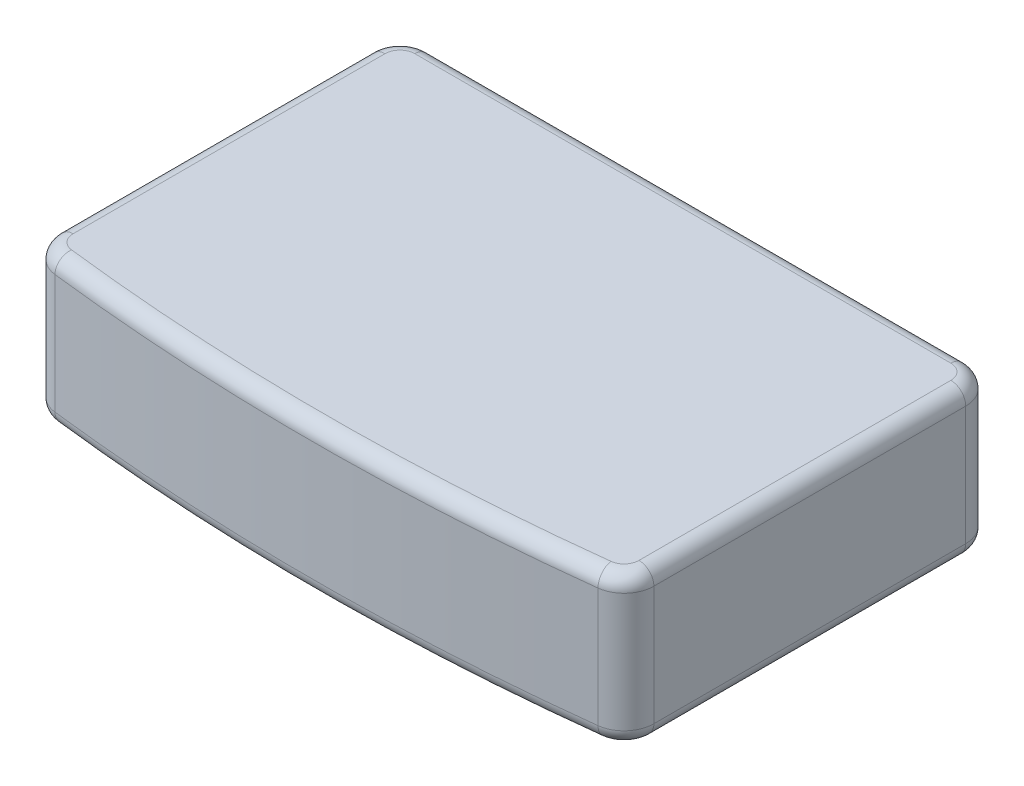
ISO-10303-21;
HEADER;
FILE_DESCRIPTION(('STEP AP214'),'2;1');
FILE_NAME('part.step','',(''),(''),'','','');
FILE_SCHEMA(('AUTOMOTIVE_DESIGN { 1 0 10303 214 1 1 1 1 }'));
ENDSEC;
DATA;
#1=APPLICATION_CONTEXT('core data for automotive mechanical design processes');
#2=APPLICATION_PROTOCOL_DEFINITION('international standard','automotive_design',2000,#1);
#3=PRODUCT_CONTEXT('',#1,'mechanical');
#4=PRODUCT('Part','Part','',(#3));
#5=PRODUCT_RELATED_PRODUCT_CATEGORY('part','',(#4));
#6=PRODUCT_DEFINITION_FORMATION('','',#4);
#7=PRODUCT_DEFINITION_CONTEXT('part definition',#1,'design');
#8=PRODUCT_DEFINITION('design','',#6,#7);
#9=PRODUCT_DEFINITION_SHAPE('','',#8);
#10=(LENGTH_UNIT() NAMED_UNIT(*) SI_UNIT(.MILLI.,.METRE.));
#11=(NAMED_UNIT(*) PLANE_ANGLE_UNIT() SI_UNIT($,.RADIAN.));
#12=(NAMED_UNIT(*) SI_UNIT($,.STERADIAN.) SOLID_ANGLE_UNIT());
#13=UNCERTAINTY_MEASURE_WITH_UNIT(LENGTH_MEASURE(1.E-05),#10,'distance_accuracy_value','');
#14=(GEOMETRIC_REPRESENTATION_CONTEXT(3) GLOBAL_UNCERTAINTY_ASSIGNED_CONTEXT((#13)) GLOBAL_UNIT_ASSIGNED_CONTEXT((#10,
#11,#12)) REPRESENTATION_CONTEXT('',''));
#15=CARTESIAN_POINT('',(0.,0.,0.));
#16=DIRECTION('',(0.,0.,1.));
#17=DIRECTION('',(1.,0.,0.));
#18=AXIS2_PLACEMENT_3D('',#15,#16,#17);
#19=CARTESIAN_POINT('',(0.499999999999997,5.,-0.643681576745131));
#20=DIRECTION('',(-1.,0.,0.));
#21=DIRECTION('',(0.,0.,1.));
#22=AXIS2_PLACEMENT_3D('',#19,#20,#21);
#23=PLANE('',#22);
#24=DIRECTION('',(0.,-1.,0.));
#25=VECTOR('',#24,1.);
#26=CARTESIAN_POINT('',(0.499999999999997,5.,-12.));
#27=LINE('',#26,#25);
#28=CARTESIAN_POINT('',(0.499999999999997,4.5,-12.));
#29=VERTEX_POINT('',#28);
#30=CARTESIAN_POINT('',(0.499999999999997,0.5,-12.));
#31=VERTEX_POINT('',#30);
#32=EDGE_CURVE('E290',#29,#31,#27,.T.);
#33=ORIENTED_EDGE('',*,*,#32,.T.);
#34=DIRECTION('',(0.,0.,-1.));
#35=VECTOR('',#34,1.);
#36=CARTESIAN_POINT('',(0.499999999999997,0.5,-1.52778282277936));
#37=LINE('',#36,#35);
#38=CARTESIAN_POINT('',(0.499999999999997,0.5,-1.52778282277936));
#39=VERTEX_POINT('',#38);
#40=EDGE_CURVE('E189',#31,#39,#37,.F.);
#41=ORIENTED_EDGE('',*,*,#40,.T.);
#42=DIRECTION('',(0.,1.,0.));
#43=VECTOR('',#42,1.);
#44=CARTESIAN_POINT('',(0.499999999999997,5.,-1.52778282277936));
#45=LINE('',#44,#43);
#46=CARTESIAN_POINT('',(0.499999999999997,4.5,-1.52778282277936));
#47=VERTEX_POINT('',#46);
#48=EDGE_CURVE('E321',#39,#47,#45,.T.);
#49=ORIENTED_EDGE('',*,*,#48,.T.);
#50=DIRECTION('',(0.,0.,-1.));
#51=VECTOR('',#50,1.);
#52=CARTESIAN_POINT('',(0.499999999999997,4.5,-0.643681576745131));
#53=LINE('',#52,#51);
#54=EDGE_CURVE('E187',#47,#29,#53,.T.);
#55=ORIENTED_EDGE('',*,*,#54,.T.);
#56=EDGE_LOOP('',(#33,#41,#49,#55));
#57=FACE_BOUND('',#56,.T.);
#58=ADVANCED_FACE('F35',(#57),#23,.T.);
#59=CARTESIAN_POINT('',(10.5,5.,-78.));
#60=DIRECTION('',(0.,-1.,0.));
#61=DIRECTION('',(0.,0.,-1.));
#62=AXIS2_PLACEMENT_3D('',#59,#60,#61);
#63=CYLINDRICAL_SURFACE('',#62,78.);
#64=DIRECTION('',(0.,-1.,0.));
#65=VECTOR('',#64,1.);
#66=CARTESIAN_POINT('',(1.38311688311688,5.,-0.534637145153116));
#67=LINE('',#66,#65);
#68=CARTESIAN_POINT('',(1.38311688311688,4.5,-0.534637145153116));
#69=VERTEX_POINT('',#68);
#70=CARTESIAN_POINT('',(1.38311688311688,0.5,-0.534637145153116));
#71=VERTEX_POINT('',#70);
#72=EDGE_CURVE('E288',#69,#71,#67,.T.);
#73=ORIENTED_EDGE('',*,*,#72,.T.);
#74=CARTESIAN_POINT('',(10.5,0.5,-78.));
#75=DIRECTION('',(0.,1.,0.));
#76=DIRECTION('',(0.,0.,1.));
#77=AXIS2_PLACEMENT_3D('',#74,#75,#76);
#78=CIRCLE('',#77,78.);
#79=CARTESIAN_POINT('',(19.6168831168831,0.5,-0.534637145153116));
#80=VERTEX_POINT('',#79);
#81=EDGE_CURVE('E197',#71,#80,#78,.T.);
#82=ORIENTED_EDGE('',*,*,#81,.T.);
#83=DIRECTION('',(0.,-1.,0.));
#84=VECTOR('',#83,1.);
#85=CARTESIAN_POINT('',(19.6168831168831,5.,-0.534637145153116));
#86=LINE('',#85,#84);
#87=CARTESIAN_POINT('',(19.6168831168831,4.5,-0.534637145153116));
#88=VERTEX_POINT('',#87);
#89=EDGE_CURVE('E171',#80,#88,#86,.F.);
#90=ORIENTED_EDGE('',*,*,#89,.T.);
#91=CARTESIAN_POINT('',(10.5,4.5,-78.));
#92=DIRECTION('',(0.,1.,0.));
#93=DIRECTION('',(0.,0.,1.));
#94=AXIS2_PLACEMENT_3D('',#91,#92,#93);
#95=CIRCLE('',#94,78.);
#96=EDGE_CURVE('E195',#88,#69,#95,.F.);
#97=ORIENTED_EDGE('',*,*,#96,.T.);
#98=EDGE_LOOP('',(#73,#82,#90,#97));
#99=FACE_BOUND('',#98,.T.);
#100=ADVANCED_FACE('F285',(#99),#63,.T.);
#101=CARTESIAN_POINT('',(20.5,5.,-0.643681576745131));
#102=DIRECTION('',(-1.,0.,0.));
#103=DIRECTION('',(0.,0.,1.));
#104=AXIS2_PLACEMENT_3D('',#101,#102,#103);
#105=PLANE('',#104);
#106=DIRECTION('',(0.,-1.,0.));
#107=VECTOR('',#106,1.);
#108=CARTESIAN_POINT('',(20.5,5.,-1.52778282277936));
#109=LINE('',#108,#107);
#110=CARTESIAN_POINT('',(20.5,4.5,-1.52778282277936));
#111=VERTEX_POINT('',#110);
#112=CARTESIAN_POINT('',(20.5,0.5,-1.52778282277936));
#113=VERTEX_POINT('',#112);
#114=EDGE_CURVE('E282',#111,#113,#109,.T.);
#115=ORIENTED_EDGE('',*,*,#114,.T.);
#116=DIRECTION('',(0.,0.,-1.));
#117=VECTOR('',#116,1.);
#118=CARTESIAN_POINT('',(20.5,0.5,-0.643681576745131));
#119=LINE('',#118,#117);
#120=CARTESIAN_POINT('',(20.5,0.5,-12.));
#121=VERTEX_POINT('',#120);
#122=EDGE_CURVE('E205',#113,#121,#119,.T.);
#123=ORIENTED_EDGE('',*,*,#122,.T.);
#124=DIRECTION('',(0.,-1.,0.));
#125=VECTOR('',#124,1.);
#126=CARTESIAN_POINT('',(20.5,5.,-12.));
#127=LINE('',#126,#125);
#128=CARTESIAN_POINT('',(20.5,4.5,-12.));
#129=VERTEX_POINT('',#128);
#130=EDGE_CURVE('E322',#121,#129,#127,.F.);
#131=ORIENTED_EDGE('',*,*,#130,.T.);
#132=DIRECTION('',(0.,0.,-1.));
#133=VECTOR('',#132,1.);
#134=CARTESIAN_POINT('',(20.5,4.5,-1.52778282277936));
#135=LINE('',#134,#133);
#136=EDGE_CURVE('E203',#129,#111,#135,.F.);
#137=ORIENTED_EDGE('',*,*,#136,.T.);
#138=EDGE_LOOP('',(#115,#123,#131,#137));
#139=FACE_BOUND('',#138,.T.);
#140=ADVANCED_FACE('F364',(#139),#105,.F.);
#141=CARTESIAN_POINT('',(0.499999999999997,5.,-13.));
#142=DIRECTION('',(0.,0.,-1.));
#143=DIRECTION('',(-1.,0.,0.));
#144=AXIS2_PLACEMENT_3D('',#141,#142,#143);
#145=PLANE('',#144);
#146=DIRECTION('',(0.,-1.,0.));
#147=VECTOR('',#146,1.);
#148=CARTESIAN_POINT('',(19.5,0.,-13.));
#149=LINE('',#148,#147);
#150=CARTESIAN_POINT('',(19.5,4.5,-13.));
#151=VERTEX_POINT('',#150);
#152=CARTESIAN_POINT('',(19.5,0.5,-13.));
#153=VERTEX_POINT('',#152);
#154=EDGE_CURVE('E328',#151,#153,#149,.T.);
#155=ORIENTED_EDGE('',*,*,#154,.T.);
#156=DIRECTION('',(1.,0.,0.));
#157=VECTOR('',#156,1.);
#158=CARTESIAN_POINT('',(1.5,0.5,-13.));
#159=LINE('',#158,#157);
#160=CARTESIAN_POINT('',(1.5,0.5,-13.));
#161=VERTEX_POINT('',#160);
#162=EDGE_CURVE('E11',#153,#161,#159,.F.);
#163=ORIENTED_EDGE('',*,*,#162,.T.);
#164=DIRECTION('',(0.,-1.,0.));
#165=VECTOR('',#164,1.);
#166=CARTESIAN_POINT('',(1.5,5.,-13.));
#167=LINE('',#166,#165);
#168=CARTESIAN_POINT('',(1.5,4.5,-13.));
#169=VERTEX_POINT('',#168);
#170=EDGE_CURVE('E319',#161,#169,#167,.F.);
#171=ORIENTED_EDGE('',*,*,#170,.T.);
#172=DIRECTION('',(1.,0.,0.));
#173=VECTOR('',#172,1.);
#174=CARTESIAN_POINT('',(0.499999999999997,4.5,-13.));
#175=LINE('',#174,#173);
#176=EDGE_CURVE('E44',#169,#151,#175,.T.);
#177=ORIENTED_EDGE('',*,*,#176,.T.);
#178=EDGE_LOOP('',(#155,#163,#171,#177));
#179=FACE_BOUND('',#178,.T.);
#180=ADVANCED_FACE('F367',(#179),#145,.T.);
#181=CARTESIAN_POINT('',(10.5,5.,-78.));
#182=DIRECTION('',(0.,1.,0.));
#183=DIRECTION('',(0.,0.,1.));
#184=AXIS2_PLACEMENT_3D('',#181,#182,#183);
#185=PLANE('',#184);
#186=DIRECTION('',(1.,0.,0.));
#187=VECTOR('',#186,1.);
#188=CARTESIAN_POINT('',(10.5,5.,-12.5));
#189=LINE('',#188,#187);
#190=CARTESIAN_POINT('',(19.5,5.,-12.5));
#191=VERTEX_POINT('',#190);
#192=CARTESIAN_POINT('',(1.5,5.,-12.5));
#193=VERTEX_POINT('',#192);
#194=EDGE_CURVE('E211',#191,#193,#189,.F.);
#195=ORIENTED_EDGE('',*,*,#194,.T.);
#196=CARTESIAN_POINT('',(1.5,5.,-12.));
#197=DIRECTION('',(0.,1.,0.));
#198=DIRECTION('',(0.,0.,1.));
#199=AXIS2_PLACEMENT_3D('',#196,#197,#198);
#200=CIRCLE('',#199,0.5);
#201=CARTESIAN_POINT('',(0.999999999999997,5.,-12.));
#202=VERTEX_POINT('',#201);
#203=EDGE_CURVE('E224',#193,#202,#200,.T.);
#204=ORIENTED_EDGE('',*,*,#203,.T.);
#205=DIRECTION('',(0.,0.,-1.));
#206=VECTOR('',#205,1.);
#207=CARTESIAN_POINT('',(0.999999999999997,5.,-78.));
#208=LINE('',#207,#206);
#209=CARTESIAN_POINT('',(0.999999999999996,5.,-1.52778282277936));
#210=VERTEX_POINT('',#209);
#211=EDGE_CURVE('E59',#202,#210,#208,.F.);
#212=ORIENTED_EDGE('',*,*,#211,.T.);
#213=CARTESIAN_POINT('',(1.5,5.,-1.52778282277936));
#214=DIRECTION('',(0.,1.,0.));
#215=DIRECTION('',(0.,0.,1.));
#216=AXIS2_PLACEMENT_3D('',#213,#214,#215);
#217=CIRCLE('',#216,0.5);
#218=CARTESIAN_POINT('',(1.44155844155844,5.,-1.03120998396623));
#219=VERTEX_POINT('',#218);
#220=EDGE_CURVE('E221',#210,#219,#217,.T.);
#221=ORIENTED_EDGE('',*,*,#220,.T.);
#222=CARTESIAN_POINT('',(10.5,5.,-78.));
#223=DIRECTION('',(0.,1.,0.));
#224=DIRECTION('',(0.,0.,1.));
#225=AXIS2_PLACEMENT_3D('',#222,#223,#224);
#226=CIRCLE('',#225,77.5);
#227=CARTESIAN_POINT('',(19.5584415584416,5.,-1.03120998396624));
#228=VERTEX_POINT('',#227);
#229=EDGE_CURVE('E219',#219,#228,#226,.T.);
#230=ORIENTED_EDGE('',*,*,#229,.T.);
#231=CARTESIAN_POINT('',(19.5,5.,-1.52778282277936));
#232=DIRECTION('',(0.,1.,0.));
#233=DIRECTION('',(0.,0.,1.));
#234=AXIS2_PLACEMENT_3D('',#231,#232,#233);
#235=CIRCLE('',#234,0.5);
#236=CARTESIAN_POINT('',(20.,5.,-1.52778282277936));
#237=VERTEX_POINT('',#236);
#238=EDGE_CURVE('E217',#228,#237,#235,.T.);
#239=ORIENTED_EDGE('',*,*,#238,.T.);
#240=DIRECTION('',(0.,0.,-1.));
#241=VECTOR('',#240,1.);
#242=CARTESIAN_POINT('',(20.,5.,-12.));
#243=LINE('',#242,#241);
#244=CARTESIAN_POINT('',(20.,5.,-12.));
#245=VERTEX_POINT('',#244);
#246=EDGE_CURVE('E215',#237,#245,#243,.T.);
#247=ORIENTED_EDGE('',*,*,#246,.T.);
#248=CARTESIAN_POINT('',(19.5,5.,-12.));
#249=DIRECTION('',(0.,1.,0.));
#250=DIRECTION('',(0.,0.,1.));
#251=AXIS2_PLACEMENT_3D('',#248,#249,#250);
#252=CIRCLE('',#251,0.5);
#253=EDGE_CURVE('E213',#245,#191,#252,.T.);
#254=ORIENTED_EDGE('',*,*,#253,.T.);
#255=EDGE_LOOP('',(#195,#204,#212,#221,#230,#239,#247,#254));
#256=FACE_BOUND('',#255,.T.);
#257=ADVANCED_FACE('F488',(#256),#185,.T.);
#258=CARTESIAN_POINT('',(10.5,0.,-78.));
#259=DIRECTION('',(0.,1.,0.));
#260=DIRECTION('',(0.,0.,1.));
#261=AXIS2_PLACEMENT_3D('',#258,#259,#260);
#262=PLANE('',#261);
#263=DIRECTION('',(0.,0.,-1.));
#264=VECTOR('',#263,1.);
#265=CARTESIAN_POINT('',(0.999999999999997,0.,-12.));
#266=LINE('',#265,#264);
#267=CARTESIAN_POINT('',(0.999999999999996,0.,-1.52778282277936));
#268=VERTEX_POINT('',#267);
#269=CARTESIAN_POINT('',(0.999999999999997,0.,-12.));
#270=VERTEX_POINT('',#269);
#271=EDGE_CURVE('E176',#268,#270,#266,.T.);
#272=ORIENTED_EDGE('',*,*,#271,.T.);
#273=CARTESIAN_POINT('',(1.5,0.,-12.));
#274=DIRECTION('',(0.,1.,0.));
#275=DIRECTION('',(0.,0.,1.));
#276=AXIS2_PLACEMENT_3D('',#273,#274,#275);
#277=CIRCLE('',#276,0.5);
#278=CARTESIAN_POINT('',(1.5,0.,-12.5));
#279=VERTEX_POINT('',#278);
#280=EDGE_CURVE('E156',#270,#279,#277,.F.);
#281=ORIENTED_EDGE('',*,*,#280,.T.);
#282=DIRECTION('',(1.,0.,0.));
#283=VECTOR('',#282,1.);
#284=CARTESIAN_POINT('',(19.5,0.,-12.5));
#285=LINE('',#284,#283);
#286=CARTESIAN_POINT('',(19.5,0.,-12.5));
#287=VERTEX_POINT('',#286);
#288=EDGE_CURVE('E164',#279,#287,#285,.T.);
#289=ORIENTED_EDGE('',*,*,#288,.T.);
#290=CARTESIAN_POINT('',(19.5,0.,-12.));
#291=DIRECTION('',(0.,1.,0.));
#292=DIRECTION('',(0.,0.,1.));
#293=AXIS2_PLACEMENT_3D('',#290,#291,#292);
#294=CIRCLE('',#293,0.5);
#295=CARTESIAN_POINT('',(20.,0.,-12.));
#296=VERTEX_POINT('',#295);
#297=EDGE_CURVE('E170',#287,#296,#294,.F.);
#298=ORIENTED_EDGE('',*,*,#297,.T.);
#299=DIRECTION('',(0.,0.,-1.));
#300=VECTOR('',#299,1.);
#301=CARTESIAN_POINT('',(20.,0.,-78.));
#302=LINE('',#301,#300);
#303=CARTESIAN_POINT('',(20.,0.,-1.52778282277936));
#304=VERTEX_POINT('',#303);
#305=EDGE_CURVE('E295',#296,#304,#302,.F.);
#306=ORIENTED_EDGE('',*,*,#305,.T.);
#307=CARTESIAN_POINT('',(19.5,0.,-1.52778282277936));
#308=DIRECTION('',(0.,1.,0.));
#309=DIRECTION('',(0.,0.,1.));
#310=AXIS2_PLACEMENT_3D('',#307,#308,#309);
#311=CIRCLE('',#310,0.5);
#312=CARTESIAN_POINT('',(19.5584415584416,0.,-1.03120998396624));
#313=VERTEX_POINT('',#312);
#314=EDGE_CURVE('E297',#304,#313,#311,.F.);
#315=ORIENTED_EDGE('',*,*,#314,.T.);
#316=CARTESIAN_POINT('',(10.5,0.,-78.));
#317=DIRECTION('',(0.,1.,0.));
#318=DIRECTION('',(0.,0.,1.));
#319=AXIS2_PLACEMENT_3D('',#316,#317,#318);
#320=CIRCLE('',#319,77.5);
#321=CARTESIAN_POINT('',(1.44155844155844,0.,-1.03120998396623));
#322=VERTEX_POINT('',#321);
#323=EDGE_CURVE('E299',#313,#322,#320,.F.);
#324=ORIENTED_EDGE('',*,*,#323,.T.);
#325=CARTESIAN_POINT('',(1.5,0.,-1.52778282277936));
#326=DIRECTION('',(0.,1.,0.));
#327=DIRECTION('',(0.,0.,1.));
#328=AXIS2_PLACEMENT_3D('',#325,#326,#327);
#329=CIRCLE('',#328,0.5);
#330=EDGE_CURVE('E182',#322,#268,#329,.F.);
#331=ORIENTED_EDGE('',*,*,#330,.T.);
#332=EDGE_LOOP('',(#272,#281,#289,#298,#306,#315,#324,#331));
#333=FACE_BOUND('',#332,.T.);
#334=CARTESIAN_POINT('',(5.5,0.,-9.));
#335=DIRECTION('',(0.,1.,0.));
#336=DIRECTION('',(0.,0.,1.));
#337=AXIS2_PLACEMENT_3D('',#334,#335,#336);
#338=CIRCLE('',#337,1.5);
#339=CARTESIAN_POINT('',(5.5,0.,-7.5));
#340=VERTEX_POINT('',#339);
#341=EDGE_CURVE('E338',#340,#340,#338,.T.);
#342=ORIENTED_EDGE('',*,*,#341,.T.);
#343=EDGE_LOOP('',(#342));
#344=FACE_BOUND('',#343,.T.);
#345=CARTESIAN_POINT('',(15.5,0.,-9.));
#346=DIRECTION('',(0.,1.,0.));
#347=DIRECTION('',(0.,0.,1.));
#348=AXIS2_PLACEMENT_3D('',#345,#346,#347);
#349=CIRCLE('',#348,1.5);
#350=CARTESIAN_POINT('',(15.5,0.,-7.5));
#351=VERTEX_POINT('',#350);
#352=EDGE_CURVE('E335',#351,#351,#349,.T.);
#353=ORIENTED_EDGE('',*,*,#352,.T.);
#354=EDGE_LOOP('',(#353));
#355=FACE_BOUND('',#354,.T.);
#356=ADVANCED_FACE('F173',(#333,#344,#355),#262,.F.);
#357=CARTESIAN_POINT('',(15.5,3.,-9.));
#358=DIRECTION('',(0.,-1.,0.));
#359=DIRECTION('',(0.,0.,-1.));
#360=AXIS2_PLACEMENT_3D('',#357,#358,#359);
#361=CYLINDRICAL_SURFACE('',#360,1.5);
#362=CARTESIAN_POINT('',(15.5,3.,-9.));
#363=DIRECTION('',(0.,1.,0.));
#364=DIRECTION('',(0.,0.,1.));
#365=AXIS2_PLACEMENT_3D('',#362,#363,#364);
#366=CIRCLE('',#365,1.5);
#367=CARTESIAN_POINT('',(15.5,3.,-7.5));
#368=VERTEX_POINT('',#367);
#369=EDGE_CURVE('E244',#368,#368,#366,.T.);
#370=ORIENTED_EDGE('',*,*,#369,.T.);
#371=EDGE_LOOP('',(#370));
#372=FACE_BOUND('',#371,.T.);
#373=ORIENTED_EDGE('',*,*,#352,.F.);
#374=EDGE_LOOP('',(#373));
#375=FACE_BOUND('',#374,.T.);
#376=ADVANCED_FACE('F487',(#372,#375),#361,.F.);
#377=CARTESIAN_POINT('',(15.5,3.,-9.));
#378=DIRECTION('',(0.,1.,0.));
#379=DIRECTION('',(0.,0.,1.));
#380=AXIS2_PLACEMENT_3D('',#377,#378,#379);
#381=PLANE('',#380);
#382=ORIENTED_EDGE('',*,*,#369,.F.);
#383=EDGE_LOOP('',(#382));
#384=FACE_BOUND('',#383,.T.);
#385=ADVANCED_FACE('F357',(#384),#381,.F.);
#386=CARTESIAN_POINT('',(5.5,3.,-9.));
#387=DIRECTION('',(0.,-1.,0.));
#388=DIRECTION('',(0.,0.,-1.));
#389=AXIS2_PLACEMENT_3D('',#386,#387,#388);
#390=CYLINDRICAL_SURFACE('',#389,1.5);
#391=CARTESIAN_POINT('',(5.5,3.,-9.));
#392=DIRECTION('',(0.,1.,0.));
#393=DIRECTION('',(0.,0.,1.));
#394=AXIS2_PLACEMENT_3D('',#391,#392,#393);
#395=CIRCLE('',#394,1.5);
#396=CARTESIAN_POINT('',(5.5,3.,-7.5));
#397=VERTEX_POINT('',#396);
#398=EDGE_CURVE('E332',#397,#397,#395,.T.);
#399=ORIENTED_EDGE('',*,*,#398,.T.);
#400=EDGE_LOOP('',(#399));
#401=FACE_BOUND('',#400,.T.);
#402=ORIENTED_EDGE('',*,*,#341,.F.);
#403=EDGE_LOOP('',(#402));
#404=FACE_BOUND('',#403,.T.);
#405=ADVANCED_FACE('F344',(#401,#404),#390,.F.);
#406=CARTESIAN_POINT('',(5.5,3.,-9.));
#407=DIRECTION('',(0.,1.,0.));
#408=DIRECTION('',(0.,0.,1.));
#409=AXIS2_PLACEMENT_3D('',#406,#407,#408);
#410=PLANE('',#409);
#411=ORIENTED_EDGE('',*,*,#398,.F.);
#412=EDGE_LOOP('',(#411));
#413=FACE_BOUND('',#412,.T.);
#414=ADVANCED_FACE('F347',(#413),#410,.F.);
#415=CARTESIAN_POINT('',(19.5,5.,-12.));
#416=DIRECTION('',(0.,1.,0.));
#417=DIRECTION('',(0.,0.,1.));
#418=AXIS2_PLACEMENT_3D('',#415,#416,#417);
#419=CYLINDRICAL_SURFACE('',#418,1.);
#420=ORIENTED_EDGE('',*,*,#130,.F.);
#421=CARTESIAN_POINT('',(19.5,0.5,-12.));
#422=DIRECTION('',(0.,1.,0.));
#423=DIRECTION('',(0.,0.,1.));
#424=AXIS2_PLACEMENT_3D('',#421,#422,#423);
#425=CIRCLE('',#424,1.);
#426=EDGE_CURVE('E209',#121,#153,#425,.T.);
#427=ORIENTED_EDGE('',*,*,#426,.T.);
#428=ORIENTED_EDGE('',*,*,#154,.F.);
#429=CARTESIAN_POINT('',(19.5,4.5,-12.));
#430=DIRECTION('',(0.,1.,0.));
#431=DIRECTION('',(0.,0.,1.));
#432=AXIS2_PLACEMENT_3D('',#429,#430,#431);
#433=CIRCLE('',#432,1.);
#434=EDGE_CURVE('E207',#151,#129,#433,.F.);
#435=ORIENTED_EDGE('',*,*,#434,.T.);
#436=EDGE_LOOP('',(#420,#427,#428,#435));
#437=FACE_BOUND('',#436,.T.);
#438=ADVANCED_FACE('F349',(#437),#419,.T.);
#439=CARTESIAN_POINT('',(1.5,5.,-12.));
#440=DIRECTION('',(0.,-1.,0.));
#441=DIRECTION('',(0.,0.,-1.));
#442=AXIS2_PLACEMENT_3D('',#439,#440,#441);
#443=CYLINDRICAL_SURFACE('',#442,1.);
#444=ORIENTED_EDGE('',*,*,#170,.F.);
#445=CARTESIAN_POINT('',(1.5,0.5,-12.));
#446=DIRECTION('',(0.,1.,0.));
#447=DIRECTION('',(0.,0.,1.));
#448=AXIS2_PLACEMENT_3D('',#445,#446,#447);
#449=CIRCLE('',#448,1.);
#450=EDGE_CURVE('E158',#161,#31,#449,.T.);
#451=ORIENTED_EDGE('',*,*,#450,.T.);
#452=ORIENTED_EDGE('',*,*,#32,.F.);
#453=CARTESIAN_POINT('',(1.5,4.5,-12.));
#454=DIRECTION('',(0.,1.,0.));
#455=DIRECTION('',(0.,0.,1.));
#456=AXIS2_PLACEMENT_3D('',#453,#454,#455);
#457=CIRCLE('',#456,1.);
#458=EDGE_CURVE('E178',#29,#169,#457,.F.);
#459=ORIENTED_EDGE('',*,*,#458,.T.);
#460=EDGE_LOOP('',(#444,#451,#452,#459));
#461=FACE_BOUND('',#460,.T.);
#462=ADVANCED_FACE('F317',(#461),#443,.T.);
#463=CARTESIAN_POINT('',(19.5,5.,-1.52778282277936));
#464=DIRECTION('',(0.,-1.,0.));
#465=DIRECTION('',(0.,0.,-1.));
#466=AXIS2_PLACEMENT_3D('',#463,#464,#465);
#467=CYLINDRICAL_SURFACE('',#466,1.);
#468=ORIENTED_EDGE('',*,*,#89,.F.);
#469=CARTESIAN_POINT('',(19.5,0.5,-1.52778282277936));
#470=DIRECTION('',(0.,1.,0.));
#471=DIRECTION('',(0.,0.,1.));
#472=AXIS2_PLACEMENT_3D('',#469,#470,#471);
#473=CIRCLE('',#472,1.);
#474=EDGE_CURVE('E201',#80,#113,#473,.T.);
#475=ORIENTED_EDGE('',*,*,#474,.T.);
#476=ORIENTED_EDGE('',*,*,#114,.F.);
#477=CARTESIAN_POINT('',(19.5,4.5,-1.52778282277936));
#478=DIRECTION('',(0.,1.,0.));
#479=DIRECTION('',(0.,0.,1.));
#480=AXIS2_PLACEMENT_3D('',#477,#478,#479);
#481=CIRCLE('',#480,1.);
#482=EDGE_CURVE('E199',#111,#88,#481,.F.);
#483=ORIENTED_EDGE('',*,*,#482,.T.);
#484=EDGE_LOOP('',(#468,#475,#476,#483));
#485=FACE_BOUND('',#484,.T.);
#486=ADVANCED_FACE('F279',(#485),#467,.T.);
#487=CARTESIAN_POINT('',(1.5,5.,-1.52778282277936));
#488=DIRECTION('',(0.,-1.,0.));
#489=DIRECTION('',(0.,0.,-1.));
#490=AXIS2_PLACEMENT_3D('',#487,#488,#489);
#491=CYLINDRICAL_SURFACE('',#490,1.);
#492=ORIENTED_EDGE('',*,*,#48,.F.);
#493=CARTESIAN_POINT('',(1.5,0.5,-1.52778282277936));
#494=DIRECTION('',(0.,1.,0.));
#495=DIRECTION('',(0.,0.,1.));
#496=AXIS2_PLACEMENT_3D('',#493,#494,#495);
#497=CIRCLE('',#496,1.);
#498=EDGE_CURVE('E193',#39,#71,#497,.T.);
#499=ORIENTED_EDGE('',*,*,#498,.T.);
#500=ORIENTED_EDGE('',*,*,#72,.F.);
#501=CARTESIAN_POINT('',(1.5,4.5,-1.52778282277936));
#502=DIRECTION('',(0.,1.,0.));
#503=DIRECTION('',(0.,0.,1.));
#504=AXIS2_PLACEMENT_3D('',#501,#502,#503);
#505=CIRCLE('',#504,1.);
#506=EDGE_CURVE('E191',#69,#47,#505,.F.);
#507=ORIENTED_EDGE('',*,*,#506,.T.);
#508=EDGE_LOOP('',(#492,#499,#500,#507));
#509=FACE_BOUND('',#508,.T.);
#510=ADVANCED_FACE('F374',(#509),#491,.T.);
#511=CARTESIAN_POINT('',(19.5,0.5,-1.52778282277936));
#512=DIRECTION('',(0.,1.,0.));
#513=DIRECTION('',(0.,0.,1.));
#514=AXIS2_PLACEMENT_3D('',#511,#512,#513);
#515=DEGENERATE_TOROIDAL_SURFACE('',#514,0.5,0.5,.T.);
#516=CARTESIAN_POINT('',(20.,0.5,-1.52778282277936));
#517=DIRECTION('',(0.,0.,-1.));
#518=DIRECTION('',(-1.,0.,0.));
#519=AXIS2_PLACEMENT_3D('',#516,#517,#518);
#520=CIRCLE('',#519,0.5);
#521=EDGE_CURVE('E238',#113,#304,#520,.T.);
#522=ORIENTED_EDGE('',*,*,#521,.F.);
#523=ORIENTED_EDGE('',*,*,#474,.F.);
#524=CARTESIAN_POINT('',(19.5584415584416,0.5,-1.03120998396624));
#525=DIRECTION('',(-0.993145677626242,0.,0.116883116883119));
#526=DIRECTION('',(0.116883116883119,0.,0.993145677626242));
#527=AXIS2_PLACEMENT_3D('',#524,#525,#526);
#528=CIRCLE('',#527,0.5);
#529=EDGE_CURVE('E241',#313,#80,#528,.T.);
#530=ORIENTED_EDGE('',*,*,#529,.F.);
#531=ORIENTED_EDGE('',*,*,#314,.F.);
#532=EDGE_LOOP('',(#522,#523,#530,#531));
#533=FACE_BOUND('',#532,.T.);
#534=ADVANCED_FACE('F377',(#533),#515,.T.);
#535=CARTESIAN_POINT('',(10.5,0.5,-78.));
#536=DIRECTION('',(0.,1.,0.));
#537=DIRECTION('',(0.,0.,1.));
#538=AXIS2_PLACEMENT_3D('',#535,#536,#537);
#539=TOROIDAL_SURFACE('',#538,77.5,0.5);
#540=ORIENTED_EDGE('',*,*,#529,.T.);
#541=ORIENTED_EDGE('',*,*,#81,.F.);
#542=CARTESIAN_POINT('',(1.44155844155844,0.5,-1.03120998396623));
#543=DIRECTION('',(-0.993145677626242,0.,-0.116883116883117));
#544=DIRECTION('',(-0.116883116883117,0.,0.993145677626242));
#545=AXIS2_PLACEMENT_3D('',#542,#543,#544);
#546=CIRCLE('',#545,0.5);
#547=EDGE_CURVE('E235',#322,#71,#546,.T.);
#548=ORIENTED_EDGE('',*,*,#547,.F.);
#549=ORIENTED_EDGE('',*,*,#323,.F.);
#550=EDGE_LOOP('',(#540,#541,#548,#549));
#551=FACE_BOUND('',#550,.T.);
#552=ADVANCED_FACE('F394',(#551),#539,.T.);
#553=CARTESIAN_POINT('',(20.,0.5,-0.643681576745131));
#554=DIRECTION('',(0.,0.,-1.));
#555=DIRECTION('',(-1.,0.,0.));
#556=AXIS2_PLACEMENT_3D('',#553,#554,#555);
#557=CYLINDRICAL_SURFACE('',#556,0.5);
#558=ORIENTED_EDGE('',*,*,#521,.T.);
#559=ORIENTED_EDGE('',*,*,#305,.F.);
#560=CARTESIAN_POINT('',(20.,0.5,-12.));
#561=DIRECTION('',(0.,0.,-1.));
#562=DIRECTION('',(-1.,0.,0.));
#563=AXIS2_PLACEMENT_3D('',#560,#561,#562);
#564=CIRCLE('',#563,0.5);
#565=EDGE_CURVE('E232',#121,#296,#564,.T.);
#566=ORIENTED_EDGE('',*,*,#565,.F.);
#567=ORIENTED_EDGE('',*,*,#122,.F.);
#568=EDGE_LOOP('',(#558,#559,#566,#567));
#569=FACE_BOUND('',#568,.T.);
#570=ADVANCED_FACE('F391',(#569),#557,.T.);
#571=CARTESIAN_POINT('',(1.5,0.5,-1.52778282277936));
#572=DIRECTION('',(0.,1.,0.));
#573=DIRECTION('',(0.,0.,1.));
#574=AXIS2_PLACEMENT_3D('',#571,#572,#573);
#575=DEGENERATE_TOROIDAL_SURFACE('',#574,0.5,0.5,.T.);
#576=ORIENTED_EDGE('',*,*,#547,.T.);
#577=ORIENTED_EDGE('',*,*,#498,.F.);
#578=CARTESIAN_POINT('',(0.999999999999996,0.5,-1.52778282277936));
#579=DIRECTION('',(0.,0.,-1.));
#580=DIRECTION('',(-1.,0.,0.));
#581=AXIS2_PLACEMENT_3D('',#578,#579,#580);
#582=CIRCLE('',#581,0.5);
#583=EDGE_CURVE('E229',#268,#39,#582,.T.);
#584=ORIENTED_EDGE('',*,*,#583,.F.);
#585=ORIENTED_EDGE('',*,*,#330,.F.);
#586=EDGE_LOOP('',(#576,#577,#584,#585));
#587=FACE_BOUND('',#586,.T.);
#588=ADVANCED_FACE('F306',(#587),#575,.T.);
#589=CARTESIAN_POINT('',(19.5,0.5,-12.));
#590=DIRECTION('',(0.,1.,0.));
#591=DIRECTION('',(0.,0.,1.));
#592=AXIS2_PLACEMENT_3D('',#589,#590,#591);
#593=DEGENERATE_TOROIDAL_SURFACE('',#592,0.5,0.5,.T.);
#594=ORIENTED_EDGE('',*,*,#565,.T.);
#595=ORIENTED_EDGE('',*,*,#297,.F.);
#596=CARTESIAN_POINT('',(19.5,0.5,-12.5));
#597=DIRECTION('',(-1.,0.,0.));
#598=DIRECTION('',(0.,0.,1.));
#599=AXIS2_PLACEMENT_3D('',#596,#597,#598);
#600=CIRCLE('',#599,0.5);
#601=EDGE_CURVE('E167',#153,#287,#600,.T.);
#602=ORIENTED_EDGE('',*,*,#601,.F.);
#603=ORIENTED_EDGE('',*,*,#426,.F.);
#604=EDGE_LOOP('',(#594,#595,#602,#603));
#605=FACE_BOUND('',#604,.T.);
#606=ADVANCED_FACE('F385',(#605),#593,.T.);
#607=CARTESIAN_POINT('',(0.999999999999997,0.5,-78.));
#608=DIRECTION('',(0.,0.,1.));
#609=DIRECTION('',(1.,0.,0.));
#610=AXIS2_PLACEMENT_3D('',#607,#608,#609);
#611=CYLINDRICAL_SURFACE('',#610,0.5);
#612=ORIENTED_EDGE('',*,*,#583,.T.);
#613=ORIENTED_EDGE('',*,*,#40,.F.);
#614=CARTESIAN_POINT('',(0.999999999999997,0.5,-12.));
#615=DIRECTION('',(0.,0.,-1.));
#616=DIRECTION('',(-1.,0.,0.));
#617=AXIS2_PLACEMENT_3D('',#614,#615,#616);
#618=CIRCLE('',#617,0.5);
#619=EDGE_CURVE('E161',#270,#31,#618,.T.);
#620=ORIENTED_EDGE('',*,*,#619,.F.);
#621=ORIENTED_EDGE('',*,*,#271,.F.);
#622=EDGE_LOOP('',(#612,#613,#620,#621));
#623=FACE_BOUND('',#622,.T.);
#624=ADVANCED_FACE('F309',(#623),#611,.T.);
#625=CARTESIAN_POINT('',(10.5,0.5,-12.5));
#626=DIRECTION('',(-1.,0.,0.));
#627=DIRECTION('',(0.,0.,1.));
#628=AXIS2_PLACEMENT_3D('',#625,#626,#627);
#629=CYLINDRICAL_SURFACE('',#628,0.5);
#630=ORIENTED_EDGE('',*,*,#601,.T.);
#631=ORIENTED_EDGE('',*,*,#288,.F.);
#632=CARTESIAN_POINT('',(1.5,0.5,-12.5));
#633=DIRECTION('',(-1.,0.,0.));
#634=DIRECTION('',(0.,0.,1.));
#635=AXIS2_PLACEMENT_3D('',#632,#633,#634);
#636=CIRCLE('',#635,0.5);
#637=EDGE_CURVE('E152',#161,#279,#636,.T.);
#638=ORIENTED_EDGE('',*,*,#637,.F.);
#639=ORIENTED_EDGE('',*,*,#162,.F.);
#640=EDGE_LOOP('',(#630,#631,#638,#639));
#641=FACE_BOUND('',#640,.T.);
#642=ADVANCED_FACE('F165',(#641),#629,.T.);
#643=CARTESIAN_POINT('',(1.5,0.5,-12.));
#644=DIRECTION('',(0.,1.,0.));
#645=DIRECTION('',(0.,0.,1.));
#646=AXIS2_PLACEMENT_3D('',#643,#644,#645);
#647=DEGENERATE_TOROIDAL_SURFACE('',#646,0.5,0.5,.T.);
#648=ORIENTED_EDGE('',*,*,#619,.T.);
#649=ORIENTED_EDGE('',*,*,#450,.F.);
#650=ORIENTED_EDGE('',*,*,#637,.T.);
#651=ORIENTED_EDGE('',*,*,#280,.F.);
#652=EDGE_LOOP('',(#648,#649,#650,#651));
#653=FACE_BOUND('',#652,.T.);
#654=ADVANCED_FACE('F154',(#653),#647,.T.);
#655=CARTESIAN_POINT('',(19.5,4.5,-1.52778282277936));
#656=DIRECTION('',(0.,1.,0.));
#657=DIRECTION('',(0.,0.,1.));
#658=AXIS2_PLACEMENT_3D('',#655,#656,#657);
#659=DEGENERATE_TOROIDAL_SURFACE('',#658,0.5,0.5,.T.);
#660=CARTESIAN_POINT('',(19.5584415584416,4.5,-1.03120998396624));
#661=DIRECTION('',(-0.993145677626242,0.,0.116883116883119));
#662=DIRECTION('',(0.116883116883119,0.,0.993145677626242));
#663=AXIS2_PLACEMENT_3D('',#660,#661,#662);
#664=CIRCLE('',#663,0.5);
#665=EDGE_CURVE('E259',#88,#228,#664,.T.);
#666=ORIENTED_EDGE('',*,*,#665,.F.);
#667=ORIENTED_EDGE('',*,*,#482,.F.);
#668=CARTESIAN_POINT('',(20.,4.5,-1.52778282277936));
#669=DIRECTION('',(0.,0.,-1.));
#670=DIRECTION('',(-1.,0.,0.));
#671=AXIS2_PLACEMENT_3D('',#668,#669,#670);
#672=CIRCLE('',#671,0.5);
#673=EDGE_CURVE('E39',#237,#111,#672,.T.);
#674=ORIENTED_EDGE('',*,*,#673,.F.);
#675=ORIENTED_EDGE('',*,*,#238,.F.);
#676=EDGE_LOOP('',(#666,#667,#674,#675));
#677=FACE_BOUND('',#676,.T.);
#678=ADVANCED_FACE('F37',(#677),#659,.T.);
#679=CARTESIAN_POINT('',(20.,4.5,-78.));
#680=DIRECTION('',(0.,0.,1.));
#681=DIRECTION('',(1.,0.,0.));
#682=AXIS2_PLACEMENT_3D('',#679,#680,#681);
#683=CYLINDRICAL_SURFACE('',#682,0.5);
#684=ORIENTED_EDGE('',*,*,#673,.T.);
#685=ORIENTED_EDGE('',*,*,#136,.F.);
#686=CARTESIAN_POINT('',(20.,4.5,-12.));
#687=DIRECTION('',(0.,0.,-1.));
#688=DIRECTION('',(-1.,0.,0.));
#689=AXIS2_PLACEMENT_3D('',#686,#687,#688);
#690=CIRCLE('',#689,0.5);
#691=EDGE_CURVE('E257',#245,#129,#690,.T.);
#692=ORIENTED_EDGE('',*,*,#691,.F.);
#693=ORIENTED_EDGE('',*,*,#246,.F.);
#694=EDGE_LOOP('',(#684,#685,#692,#693));
#695=FACE_BOUND('',#694,.T.);
#696=ADVANCED_FACE('F270',(#695),#683,.T.);
#697=CARTESIAN_POINT('',(10.5,4.5,-78.));
#698=DIRECTION('',(0.,1.,0.));
#699=DIRECTION('',(0.,0.,1.));
#700=AXIS2_PLACEMENT_3D('',#697,#698,#699);
#701=TOROIDAL_SURFACE('',#700,77.5,0.5);
#702=ORIENTED_EDGE('',*,*,#665,.T.);
#703=ORIENTED_EDGE('',*,*,#229,.F.);
#704=CARTESIAN_POINT('',(1.44155844155844,4.5,-1.03120998396624));
#705=DIRECTION('',(-0.993145677626242,0.,-0.116883116883117));
#706=DIRECTION('',(-0.116883116883117,0.,0.993145677626242));
#707=AXIS2_PLACEMENT_3D('',#704,#705,#706);
#708=CIRCLE('',#707,0.5);
#709=EDGE_CURVE('E254',#69,#219,#708,.T.);
#710=ORIENTED_EDGE('',*,*,#709,.F.);
#711=ORIENTED_EDGE('',*,*,#96,.F.);
#712=EDGE_LOOP('',(#702,#703,#710,#711));
#713=FACE_BOUND('',#712,.T.);
#714=ADVANCED_FACE('F420',(#713),#701,.T.);
#715=CARTESIAN_POINT('',(19.5,4.5,-12.));
#716=DIRECTION('',(0.,1.,0.));
#717=DIRECTION('',(0.,0.,1.));
#718=AXIS2_PLACEMENT_3D('',#715,#716,#717);
#719=DEGENERATE_TOROIDAL_SURFACE('',#718,0.5,0.5,.T.);
#720=ORIENTED_EDGE('',*,*,#691,.T.);
#721=ORIENTED_EDGE('',*,*,#434,.F.);
#722=CARTESIAN_POINT('',(19.5,4.5,-12.5));
#723=DIRECTION('',(-1.,0.,0.));
#724=DIRECTION('',(0.,0.,1.));
#725=AXIS2_PLACEMENT_3D('',#722,#723,#724);
#726=CIRCLE('',#725,0.5);
#727=EDGE_CURVE('E251',#191,#151,#726,.T.);
#728=ORIENTED_EDGE('',*,*,#727,.F.);
#729=ORIENTED_EDGE('',*,*,#253,.F.);
#730=EDGE_LOOP('',(#720,#721,#728,#729));
#731=FACE_BOUND('',#730,.T.);
#732=ADVANCED_FACE('F416',(#731),#719,.T.);
#733=CARTESIAN_POINT('',(1.5,4.5,-1.52778282277936));
#734=DIRECTION('',(0.,1.,0.));
#735=DIRECTION('',(0.,0.,1.));
#736=AXIS2_PLACEMENT_3D('',#733,#734,#735);
#737=DEGENERATE_TOROIDAL_SURFACE('',#736,0.5,0.5,.T.);
#738=ORIENTED_EDGE('',*,*,#709,.T.);
#739=ORIENTED_EDGE('',*,*,#220,.F.);
#740=CARTESIAN_POINT('',(0.999999999999996,4.5,-1.52778282277936));
#741=DIRECTION('',(0.,0.,-1.));
#742=DIRECTION('',(-1.,0.,0.));
#743=AXIS2_PLACEMENT_3D('',#740,#741,#742);
#744=CIRCLE('',#743,0.5);
#745=EDGE_CURVE('E248',#47,#210,#744,.T.);
#746=ORIENTED_EDGE('',*,*,#745,.F.);
#747=ORIENTED_EDGE('',*,*,#506,.F.);
#748=EDGE_LOOP('',(#738,#739,#746,#747));
#749=FACE_BOUND('',#748,.T.);
#750=ADVANCED_FACE('F412',(#749),#737,.T.);
#751=CARTESIAN_POINT('',(0.499999999999997,4.5,-12.5));
#752=DIRECTION('',(1.,0.,0.));
#753=DIRECTION('',(0.,0.,-1.));
#754=AXIS2_PLACEMENT_3D('',#751,#752,#753);
#755=CYLINDRICAL_SURFACE('',#754,0.5);
#756=ORIENTED_EDGE('',*,*,#727,.T.);
#757=ORIENTED_EDGE('',*,*,#176,.F.);
#758=CARTESIAN_POINT('',(1.5,4.5,-12.5));
#759=DIRECTION('',(-1.,0.,0.));
#760=DIRECTION('',(0.,0.,1.));
#761=AXIS2_PLACEMENT_3D('',#758,#759,#760);
#762=CIRCLE('',#761,0.5);
#763=EDGE_CURVE('E246',#193,#169,#762,.T.);
#764=ORIENTED_EDGE('',*,*,#763,.F.);
#765=ORIENTED_EDGE('',*,*,#194,.F.);
#766=EDGE_LOOP('',(#756,#757,#764,#765));
#767=FACE_BOUND('',#766,.T.);
#768=ADVANCED_FACE('F408',(#767),#755,.T.);
#769=CARTESIAN_POINT('',(0.999999999999997,4.5,-0.643681576745131));
#770=DIRECTION('',(0.,0.,-1.));
#771=DIRECTION('',(-1.,0.,0.));
#772=AXIS2_PLACEMENT_3D('',#769,#770,#771);
#773=CYLINDRICAL_SURFACE('',#772,0.5);
#774=ORIENTED_EDGE('',*,*,#745,.T.);
#775=ORIENTED_EDGE('',*,*,#211,.F.);
#776=CARTESIAN_POINT('',(0.999999999999997,4.5,-12.));
#777=DIRECTION('',(0.,0.,-1.));
#778=DIRECTION('',(-1.,0.,0.));
#779=AXIS2_PLACEMENT_3D('',#776,#777,#778);
#780=CIRCLE('',#779,0.5);
#781=EDGE_CURVE('E52',#29,#202,#780,.T.);
#782=ORIENTED_EDGE('',*,*,#781,.F.);
#783=ORIENTED_EDGE('',*,*,#54,.F.);
#784=EDGE_LOOP('',(#774,#775,#782,#783));
#785=FACE_BOUND('',#784,.T.);
#786=ADVANCED_FACE('F405',(#785),#773,.T.);
#787=CARTESIAN_POINT('',(1.5,4.5,-12.));
#788=DIRECTION('',(0.,1.,0.));
#789=DIRECTION('',(0.,0.,1.));
#790=AXIS2_PLACEMENT_3D('',#787,#788,#789);
#791=DEGENERATE_TOROIDAL_SURFACE('',#790,0.5,0.5,.T.);
#792=ORIENTED_EDGE('',*,*,#763,.T.);
#793=ORIENTED_EDGE('',*,*,#458,.F.);
#794=ORIENTED_EDGE('',*,*,#781,.T.);
#795=ORIENTED_EDGE('',*,*,#203,.F.);
#796=EDGE_LOOP('',(#792,#793,#794,#795));
#797=FACE_BOUND('',#796,.T.);
#798=ADVANCED_FACE('F402',(#797),#791,.T.);
#799=CLOSED_SHELL('',(#58,#100,#140,#180,#257,#356,#376,#385,#405,#414,#438,#462,#486,#510,#534,
#552,#570,#588,#606,#624,#642,#654,#678,#696,#714,#732,#750,#768,#786,#798));
#800=MANIFOLD_SOLID_BREP('B2',#799);
#801=ADVANCED_BREP_SHAPE_REPRESENTATION('',(#18,#800),#14);
#802=SHAPE_DEFINITION_REPRESENTATION(#9,#801);
ENDSEC;
END-ISO-10303-21;
